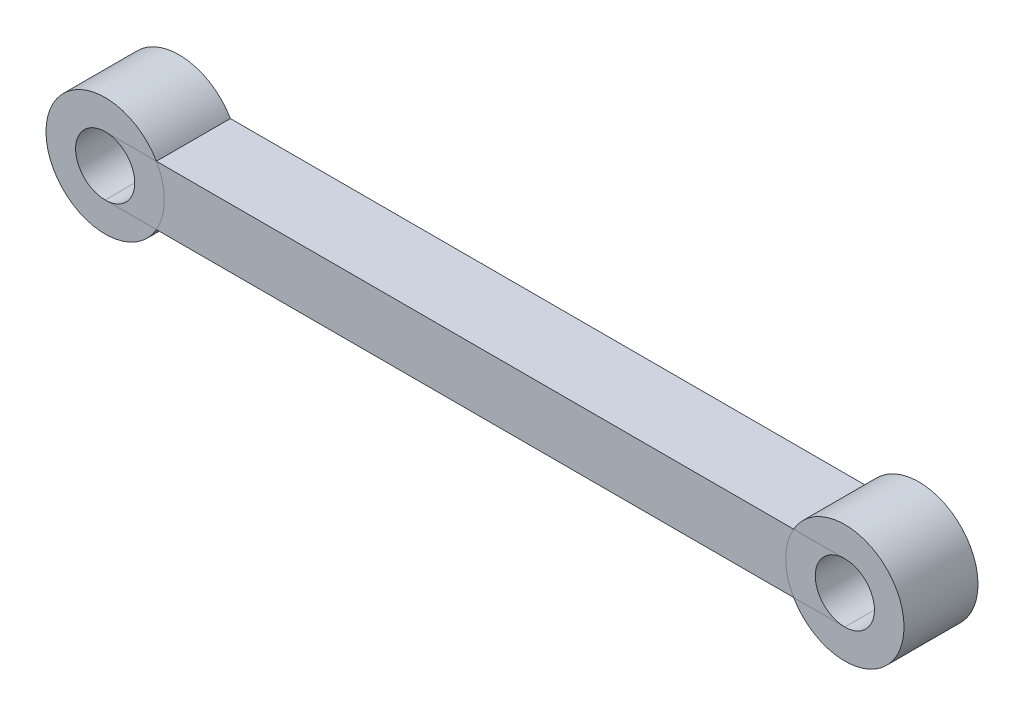
ISO-10303-21;
HEADER;
FILE_DESCRIPTION(('STEP AP214'),'2;1');
FILE_NAME('part.step','',(''),(''),'','','');
FILE_SCHEMA(('AUTOMOTIVE_DESIGN { 1 0 10303 214 1 1 1 1 }'));
ENDSEC;
DATA;
#1=APPLICATION_CONTEXT('core data for automotive mechanical design processes');
#2=APPLICATION_PROTOCOL_DEFINITION('international standard','automotive_design',2000,#1);
#3=PRODUCT_CONTEXT('',#1,'mechanical');
#4=PRODUCT('Part','Part','',(#3));
#5=PRODUCT_RELATED_PRODUCT_CATEGORY('part','',(#4));
#6=PRODUCT_DEFINITION_FORMATION('','',#4);
#7=PRODUCT_DEFINITION_CONTEXT('part definition',#1,'design');
#8=PRODUCT_DEFINITION('design','',#6,#7);
#9=PRODUCT_DEFINITION_SHAPE('','',#8);
#10=(LENGTH_UNIT() NAMED_UNIT(*) SI_UNIT(.MILLI.,.METRE.));
#11=(NAMED_UNIT(*) PLANE_ANGLE_UNIT() SI_UNIT($,.RADIAN.));
#12=(NAMED_UNIT(*) SI_UNIT($,.STERADIAN.) SOLID_ANGLE_UNIT());
#13=UNCERTAINTY_MEASURE_WITH_UNIT(LENGTH_MEASURE(1.E-05),#10,'distance_accuracy_value','');
#14=(GEOMETRIC_REPRESENTATION_CONTEXT(3) GLOBAL_UNCERTAINTY_ASSIGNED_CONTEXT((#13)) GLOBAL_UNIT_ASSIGNED_CONTEXT((#10,
#11,#12)) REPRESENTATION_CONTEXT('',''));
#15=CARTESIAN_POINT('',(0.,0.,0.));
#16=DIRECTION('',(0.,0.,1.));
#17=DIRECTION('',(1.,0.,0.));
#18=AXIS2_PLACEMENT_3D('',#15,#16,#17);
#19=CARTESIAN_POINT('',(0.,0.,0.));
#20=DIRECTION('',(0.,0.,1.));
#21=DIRECTION('',(1.,0.,0.));
#22=AXIS2_PLACEMENT_3D('',#19,#20,#21);
#23=CYLINDRICAL_SURFACE('',#22,4.00000000000002);
#24=CARTESIAN_POINT('',(0.,0.,5.));
#25=DIRECTION('',(0.,0.,1.));
#26=DIRECTION('',(1.,0.,0.));
#27=AXIS2_PLACEMENT_3D('',#24,#25,#26);
#28=CIRCLE('',#27,4.00000000000002);
#29=CARTESIAN_POINT('',(3.46410161513779,-1.99999999999995,5.));
#30=VERTEX_POINT('',#29);
#31=CARTESIAN_POINT('',(3.46410161513778,2.00000000000003,5.));
#32=VERTEX_POINT('',#31);
#33=EDGE_CURVE('P0_E97',#30,#32,#28,.T.);
#34=ORIENTED_EDGE('',*,*,#33,.F.);
#35=DIRECTION('',(0.,0.,1.));
#36=VECTOR('',#35,1.);
#37=CARTESIAN_POINT('',(3.46410161513779,-1.99999999999995,0.));
#38=LINE('',#37,#36);
#39=CARTESIAN_POINT('',(3.46410161513779,-1.99999999999995,0.));
#40=VERTEX_POINT('',#39);
#41=EDGE_CURVE('P0_E11',#40,#30,#38,.T.);
#42=ORIENTED_EDGE('',*,*,#41,.F.);
#43=CARTESIAN_POINT('',(0.,0.,0.));
#44=DIRECTION('',(0.,0.,1.));
#45=DIRECTION('',(1.,0.,0.));
#46=AXIS2_PLACEMENT_3D('',#43,#44,#45);
#47=CIRCLE('',#46,4.00000000000002);
#48=CARTESIAN_POINT('',(3.46410161513778,2.00000000000003,0.));
#49=VERTEX_POINT('',#48);
#50=EDGE_CURVE('P0_E91',#40,#49,#47,.T.);
#51=ORIENTED_EDGE('',*,*,#50,.T.);
#52=DIRECTION('',(0.,0.,1.));
#53=VECTOR('',#52,1.);
#54=CARTESIAN_POINT('',(3.46410161513778,2.00000000000003,0.));
#55=LINE('',#54,#53);
#56=EDGE_CURVE('P0_E36',#49,#32,#55,.T.);
#57=ORIENTED_EDGE('',*,*,#56,.T.);
#58=EDGE_LOOP('',(#34,#42,#51,#57));
#59=FACE_BOUND('',#58,.T.);
#60=ADVANCED_FACE('P0_F33',(#59),#23,.T.);
#61=CARTESIAN_POINT('',(0.,-2.,0.));
#62=DIRECTION('',(0.,-1.,0.));
#63=DIRECTION('',(1.,0.,0.));
#64=AXIS2_PLACEMENT_3D('',#61,#62,#63);
#65=PLANE('',#64);
#66=DIRECTION('',(1.,0.,0.));
#67=VECTOR('',#66,1.);
#68=CARTESIAN_POINT('',(0.,-2.,5.));
#69=LINE('',#68,#67);
#70=CARTESIAN_POINT('',(0.,-2.,5.));
#71=VERTEX_POINT('',#70);
#72=EDGE_CURVE('P0_E93',#71,#30,#69,.T.);
#73=ORIENTED_EDGE('',*,*,#72,.F.);
#74=DIRECTION('',(0.,0.,1.));
#75=VECTOR('',#74,1.);
#76=CARTESIAN_POINT('',(0.,-2.,0.));
#77=LINE('',#76,#75);
#78=CARTESIAN_POINT('',(0.,-2.,0.));
#79=VERTEX_POINT('',#78);
#80=EDGE_CURVE('P0_E42',#79,#71,#77,.T.);
#81=ORIENTED_EDGE('',*,*,#80,.F.);
#82=DIRECTION('',(1.,0.,0.));
#83=VECTOR('',#82,1.);
#84=CARTESIAN_POINT('',(0.,-2.,0.));
#85=LINE('',#84,#83);
#86=EDGE_CURVE('P0_E88',#79,#40,#85,.T.);
#87=ORIENTED_EDGE('',*,*,#86,.T.);
#88=ORIENTED_EDGE('',*,*,#41,.T.);
#89=EDGE_LOOP('',(#73,#81,#87,#88));
#90=FACE_BOUND('',#89,.T.);
#91=ADVANCED_FACE('P0_F107',(#90),#65,.T.);
#92=CARTESIAN_POINT('',(0.,0.,0.));
#93=DIRECTION('',(0.,0.,1.));
#94=DIRECTION('',(1.,0.,0.));
#95=AXIS2_PLACEMENT_3D('',#92,#93,#94);
#96=CYLINDRICAL_SURFACE('',#95,2.);
#97=CARTESIAN_POINT('',(0.,0.,5.));
#98=DIRECTION('',(0.,0.,-1.));
#99=DIRECTION('',(-1.,0.,0.));
#100=AXIS2_PLACEMENT_3D('',#97,#98,#99);
#101=CIRCLE('',#100,2.);
#102=CARTESIAN_POINT('',(0.,2.,5.));
#103=VERTEX_POINT('',#102);
#104=EDGE_CURVE('P0_E83',#103,#71,#101,.T.);
#105=ORIENTED_EDGE('',*,*,#104,.F.);
#106=DIRECTION('',(0.,0.,1.));
#107=VECTOR('',#106,1.);
#108=CARTESIAN_POINT('',(0.,2.,0.));
#109=LINE('',#108,#107);
#110=CARTESIAN_POINT('',(0.,2.,0.));
#111=VERTEX_POINT('',#110);
#112=EDGE_CURVE('P0_E78',#111,#103,#109,.T.);
#113=ORIENTED_EDGE('',*,*,#112,.F.);
#114=CARTESIAN_POINT('',(0.,0.,0.));
#115=DIRECTION('',(0.,0.,-1.));
#116=DIRECTION('',(-1.,0.,0.));
#117=AXIS2_PLACEMENT_3D('',#114,#115,#116);
#118=CIRCLE('',#117,2.);
#119=EDGE_CURVE('P0_E81',#111,#79,#118,.T.);
#120=ORIENTED_EDGE('',*,*,#119,.T.);
#121=ORIENTED_EDGE('',*,*,#80,.T.);
#122=EDGE_LOOP('',(#105,#113,#120,#121));
#123=FACE_BOUND('',#122,.T.);
#124=ADVANCED_FACE('P0_F80',(#123),#96,.F.);
#125=CARTESIAN_POINT('',(3.46410161513778,2.00000000000003,0.));
#126=DIRECTION('',(0.,1.,0.));
#127=DIRECTION('',(-1.,0.,0.));
#128=AXIS2_PLACEMENT_3D('',#125,#126,#127);
#129=PLANE('',#128);
#130=DIRECTION('',(-1.,0.,0.));
#131=VECTOR('',#130,1.);
#132=CARTESIAN_POINT('',(3.46410161513778,2.00000000000003,5.));
#133=LINE('',#132,#131);
#134=EDGE_CURVE('P0_E100',#32,#103,#133,.T.);
#135=ORIENTED_EDGE('',*,*,#134,.F.);
#136=ORIENTED_EDGE('',*,*,#56,.F.);
#137=DIRECTION('',(-1.,0.,0.));
#138=VECTOR('',#137,1.);
#139=CARTESIAN_POINT('',(3.46410161513778,2.00000000000003,0.));
#140=LINE('',#139,#138);
#141=EDGE_CURVE('P0_E87',#49,#111,#140,.T.);
#142=ORIENTED_EDGE('',*,*,#141,.T.);
#143=ORIENTED_EDGE('',*,*,#112,.T.);
#144=EDGE_LOOP('',(#135,#136,#142,#143));
#145=FACE_BOUND('',#144,.T.);
#146=ADVANCED_FACE('P0_F90',(#145),#129,.T.);
#147=CARTESIAN_POINT('',(0.,0.,0.));
#148=DIRECTION('',(0.,0.,1.));
#149=DIRECTION('',(1.,0.,0.));
#150=AXIS2_PLACEMENT_3D('',#147,#148,#149);
#151=PLANE('',#150);
#152=ORIENTED_EDGE('',*,*,#50,.F.);
#153=ORIENTED_EDGE('',*,*,#86,.F.);
#154=ORIENTED_EDGE('',*,*,#119,.F.);
#155=ORIENTED_EDGE('',*,*,#141,.F.);
#156=EDGE_LOOP('',(#152,#153,#154,#155));
#157=FACE_BOUND('',#156,.T.);
#158=ADVANCED_FACE('P0_F86',(#157),#151,.F.);
#159=CARTESIAN_POINT('',(0.,0.,5.));
#160=DIRECTION('',(0.,0.,1.));
#161=DIRECTION('',(1.,0.,0.));
#162=AXIS2_PLACEMENT_3D('',#159,#160,#161);
#163=PLANE('',#162);
#164=ORIENTED_EDGE('',*,*,#33,.T.);
#165=ORIENTED_EDGE('',*,*,#134,.T.);
#166=ORIENTED_EDGE('',*,*,#104,.T.);
#167=ORIENTED_EDGE('',*,*,#72,.T.);
#168=EDGE_LOOP('',(#164,#165,#166,#167));
#169=FACE_BOUND('',#168,.T.);
#170=ADVANCED_FACE('P0_F106',(#169),#163,.T.);
#171=CLOSED_SHELL('',(#60,#91,#124,#146,#158,#170));
#172=MANIFOLD_SOLID_BREP('P0_B2',#171);
#173=CARTESIAN_POINT('',(3.464101615138,-2.,0.));
#174=DIRECTION('',(0.,1.,0.));
#175=DIRECTION('',(0.,0.,1.));
#176=AXIS2_PLACEMENT_3D('',#173,#174,#175);
#177=PLANE('',#176);
#178=DIRECTION('',(0.,0.,-1.));
#179=VECTOR('',#178,1.);
#180=CARTESIAN_POINT('',(46.5358983848622,-1.9999999999999,0.));
#181=LINE('',#180,#179);
#182=CARTESIAN_POINT('',(46.5358983848622,-1.99999999999995,0.));
#183=VERTEX_POINT('',#182);
#184=CARTESIAN_POINT('',(46.5358983848622,-1.99999999999995,5.));
#185=VERTEX_POINT('',#184);
#186=EDGE_CURVE('P1_E69',#183,#185,#181,.F.);
#187=ORIENTED_EDGE('',*,*,#186,.T.);
#188=DIRECTION('',(1.,0.,0.));
#189=VECTOR('',#188,1.);
#190=CARTESIAN_POINT('',(0.,-2.,5.));
#191=LINE('',#190,#189);
#192=CARTESIAN_POINT('',(3.46410161513788,-2.,5.));
#193=VERTEX_POINT('',#192);
#194=EDGE_CURVE('P1_E95',#193,#185,#191,.T.);
#195=ORIENTED_EDGE('',*,*,#194,.F.);
#196=DIRECTION('',(0.,0.,1.));
#197=VECTOR('',#196,1.);
#198=CARTESIAN_POINT('',(3.464101615138,-2.,0.));
#199=LINE('',#198,#197);
#200=CARTESIAN_POINT('',(3.46410161513788,-2.,0.));
#201=VERTEX_POINT('',#200);
#202=EDGE_CURVE('P1_E71',#201,#193,#199,.T.);
#203=ORIENTED_EDGE('',*,*,#202,.F.);
#204=DIRECTION('',(1.,0.,0.));
#205=VECTOR('',#204,1.);
#206=CARTESIAN_POINT('',(0.,-2.,0.));
#207=LINE('',#206,#205);
#208=EDGE_CURVE('P1_E67',#201,#183,#207,.T.);
#209=ORIENTED_EDGE('',*,*,#208,.T.);
#210=EDGE_LOOP('',(#187,#195,#203,#209));
#211=FACE_BOUND('',#210,.T.);
#212=ADVANCED_FACE('P1_F20',(#211),#177,.F.);
#213=CARTESIAN_POINT('',(0.,0.,0.));
#214=DIRECTION('',(0.,0.,-1.));
#215=DIRECTION('',(-1.,0.,0.));
#216=AXIS2_PLACEMENT_3D('',#213,#214,#215);
#217=CYLINDRICAL_SURFACE('',#216,4.);
#218=CARTESIAN_POINT('',(0.,0.,5.));
#219=DIRECTION('',(0.,0.,-1.));
#220=DIRECTION('',(-1.,0.,0.));
#221=AXIS2_PLACEMENT_3D('',#218,#219,#220);
#222=CIRCLE('',#221,4.);
#223=CARTESIAN_POINT('',(3.46410161513788,2.,5.));
#224=VERTEX_POINT('',#223);
#225=EDGE_CURVE('P1_E23',#224,#193,#222,.T.);
#226=ORIENTED_EDGE('',*,*,#225,.F.);
#227=DIRECTION('',(0.,0.,1.));
#228=VECTOR('',#227,1.);
#229=CARTESIAN_POINT('',(3.464101615138,2.,0.));
#230=LINE('',#229,#228);
#231=CARTESIAN_POINT('',(3.46410161513788,2.,0.));
#232=VERTEX_POINT('',#231);
#233=EDGE_CURVE('P1_E61',#232,#224,#230,.T.);
#234=ORIENTED_EDGE('',*,*,#233,.F.);
#235=CARTESIAN_POINT('',(0.,0.,0.));
#236=DIRECTION('',(0.,0.,-1.));
#237=DIRECTION('',(-1.,0.,0.));
#238=AXIS2_PLACEMENT_3D('',#235,#236,#237);
#239=CIRCLE('',#238,4.);
#240=EDGE_CURVE('P1_E83',#232,#201,#239,.T.);
#241=ORIENTED_EDGE('',*,*,#240,.T.);
#242=ORIENTED_EDGE('',*,*,#202,.T.);
#243=EDGE_LOOP('',(#226,#234,#241,#242));
#244=FACE_BOUND('',#243,.T.);
#245=ADVANCED_FACE('P1_F109',(#244),#217,.F.);
#246=CARTESIAN_POINT('',(0.,-2.,5.));
#247=DIRECTION('',(0.,0.,1.));
#248=DIRECTION('',(1.,0.,0.));
#249=AXIS2_PLACEMENT_3D('',#246,#247,#248);
#250=PLANE('',#249);
#251=DIRECTION('',(1.,0.,0.));
#252=VECTOR('',#251,1.);
#253=CARTESIAN_POINT('',(3.464101615138,2.,5.));
#254=LINE('',#253,#252);
#255=CARTESIAN_POINT('',(46.5358983848621,2.,5.));
#256=VERTEX_POINT('',#255);
#257=EDGE_CURVE('P1_E94',#224,#256,#254,.T.);
#258=ORIENTED_EDGE('',*,*,#257,.F.);
#259=ORIENTED_EDGE('',*,*,#225,.T.);
#260=ORIENTED_EDGE('',*,*,#194,.T.);
#261=CARTESIAN_POINT('',(50.,0.,5.));
#262=DIRECTION('',(0.,0.,-1.));
#263=DIRECTION('',(-1.,0.,0.));
#264=AXIS2_PLACEMENT_3D('',#261,#262,#263);
#265=CIRCLE('',#264,4.);
#266=EDGE_CURVE('P1_E74',#185,#256,#265,.T.);
#267=ORIENTED_EDGE('',*,*,#266,.T.);
#268=EDGE_LOOP('',(#258,#259,#260,#267));
#269=FACE_BOUND('',#268,.T.);
#270=ADVANCED_FACE('P1_F92',(#269),#250,.T.);
#271=CARTESIAN_POINT('',(50.,0.,0.));
#272=DIRECTION('',(0.,0.,-1.));
#273=DIRECTION('',(-1.,0.,0.));
#274=AXIS2_PLACEMENT_3D('',#271,#272,#273);
#275=CYLINDRICAL_SURFACE('',#274,4.);
#276=ORIENTED_EDGE('',*,*,#266,.F.);
#277=ORIENTED_EDGE('',*,*,#186,.F.);
#278=CARTESIAN_POINT('',(50.,0.,0.));
#279=DIRECTION('',(0.,0.,-1.));
#280=DIRECTION('',(-1.,0.,0.));
#281=AXIS2_PLACEMENT_3D('',#278,#279,#280);
#282=CIRCLE('',#281,4.);
#283=CARTESIAN_POINT('',(46.5358983848621,2.,0.));
#284=VERTEX_POINT('',#283);
#285=EDGE_CURVE('P1_E39',#183,#284,#282,.T.);
#286=ORIENTED_EDGE('',*,*,#285,.T.);
#287=DIRECTION('',(0.,0.,1.));
#288=VECTOR('',#287,1.);
#289=CARTESIAN_POINT('',(46.535898384862,2.,0.));
#290=LINE('',#289,#288);
#291=EDGE_CURVE('P1_E30',#256,#284,#290,.F.);
#292=ORIENTED_EDGE('',*,*,#291,.F.);
#293=EDGE_LOOP('',(#276,#277,#286,#292));
#294=FACE_BOUND('',#293,.T.);
#295=ADVANCED_FACE('P1_F77',(#294),#275,.F.);
#296=CARTESIAN_POINT('',(0.,-2.,0.));
#297=DIRECTION('',(0.,0.,1.));
#298=DIRECTION('',(1.,0.,0.));
#299=AXIS2_PLACEMENT_3D('',#296,#297,#298);
#300=PLANE('',#299);
#301=DIRECTION('',(1.,0.,0.));
#302=VECTOR('',#301,1.);
#303=CARTESIAN_POINT('',(3.464101615138,2.,0.));
#304=LINE('',#303,#302);
#305=EDGE_CURVE('P1_E12',#284,#232,#304,.F.);
#306=ORIENTED_EDGE('',*,*,#305,.F.);
#307=ORIENTED_EDGE('',*,*,#285,.F.);
#308=ORIENTED_EDGE('',*,*,#208,.F.);
#309=ORIENTED_EDGE('',*,*,#240,.F.);
#310=EDGE_LOOP('',(#306,#307,#308,#309));
#311=FACE_BOUND('',#310,.T.);
#312=ADVANCED_FACE('P1_F80',(#311),#300,.F.);
#313=CARTESIAN_POINT('',(3.464101615138,2.,0.));
#314=DIRECTION('',(0.,1.,0.));
#315=DIRECTION('',(0.,0.,1.));
#316=AXIS2_PLACEMENT_3D('',#313,#314,#315);
#317=PLANE('',#316);
#318=ORIENTED_EDGE('',*,*,#291,.T.);
#319=ORIENTED_EDGE('',*,*,#305,.T.);
#320=ORIENTED_EDGE('',*,*,#233,.T.);
#321=ORIENTED_EDGE('',*,*,#257,.T.);
#322=EDGE_LOOP('',(#318,#319,#320,#321));
#323=FACE_BOUND('',#322,.T.);
#324=ADVANCED_FACE('P1_F99',(#323),#317,.T.);
#325=CLOSED_SHELL('',(#212,#245,#270,#295,#312,#324));
#326=MANIFOLD_SOLID_BREP('P1_B1',#325);
#327=CARTESIAN_POINT('',(50.,0.,0.));
#328=DIRECTION('',(0.,0.,-1.));
#329=DIRECTION('',(-1.,0.,0.));
#330=AXIS2_PLACEMENT_3D('',#327,#328,#329);
#331=CYLINDRICAL_SURFACE('',#330,4.);
#332=CARTESIAN_POINT('',(50.,0.,5.));
#333=DIRECTION('',(0.,0.,-1.));
#334=DIRECTION('',(-1.,0.,0.));
#335=AXIS2_PLACEMENT_3D('',#332,#333,#334);
#336=CIRCLE('',#335,4.);
#337=CARTESIAN_POINT('',(46.5358983848621,2.,5.));
#338=VERTEX_POINT('',#337);
#339=CARTESIAN_POINT('',(46.5358983848621,-2.,5.));
#340=VERTEX_POINT('',#339);
#341=EDGE_CURVE('P2_E74',#338,#340,#336,.F.);
#342=ORIENTED_EDGE('',*,*,#341,.F.);
#343=DIRECTION('',(0.,0.,1.));
#344=VECTOR('',#343,1.);
#345=CARTESIAN_POINT('',(46.535898384862,2.,0.));
#346=LINE('',#345,#344);
#347=CARTESIAN_POINT('',(46.5358983848621,2.,0.));
#348=VERTEX_POINT('',#347);
#349=EDGE_CURVE('P2_E69',#348,#338,#346,.T.);
#350=ORIENTED_EDGE('',*,*,#349,.F.);
#351=CARTESIAN_POINT('',(50.,0.,0.));
#352=DIRECTION('',(0.,0.,-1.));
#353=DIRECTION('',(-1.,0.,0.));
#354=AXIS2_PLACEMENT_3D('',#351,#352,#353);
#355=CIRCLE('',#354,4.);
#356=CARTESIAN_POINT('',(46.5358983848621,-2.,0.));
#357=VERTEX_POINT('',#356);
#358=EDGE_CURVE('P2_E22',#348,#357,#355,.F.);
#359=ORIENTED_EDGE('',*,*,#358,.T.);
#360=DIRECTION('',(0.,0.,1.));
#361=VECTOR('',#360,1.);
#362=CARTESIAN_POINT('',(46.535898384862,-2.,0.));
#363=LINE('',#362,#361);
#364=EDGE_CURVE('P2_E67',#357,#340,#363,.T.);
#365=ORIENTED_EDGE('',*,*,#364,.T.);
#366=EDGE_LOOP('',(#342,#350,#359,#365));
#367=FACE_BOUND('',#366,.T.);
#368=ADVANCED_FACE('P2_F19',(#367),#331,.T.);
#369=CARTESIAN_POINT('',(0.,-2.,0.));
#370=DIRECTION('',(0.,0.,1.));
#371=DIRECTION('',(1.,0.,0.));
#372=AXIS2_PLACEMENT_3D('',#369,#370,#371);
#373=PLANE('',#372);
#374=DIRECTION('',(1.,0.,0.));
#375=VECTOR('',#374,1.);
#376=CARTESIAN_POINT('',(46.535898384862,-2.,0.));
#377=LINE('',#376,#375);
#378=CARTESIAN_POINT('',(50.,-2.,0.));
#379=VERTEX_POINT('',#378);
#380=EDGE_CURVE('P2_E62',#379,#357,#377,.F.);
#381=ORIENTED_EDGE('',*,*,#380,.T.);
#382=ORIENTED_EDGE('',*,*,#358,.F.);
#383=DIRECTION('',(1.,0.,0.));
#384=VECTOR('',#383,1.);
#385=CARTESIAN_POINT('',(46.535898384862,2.,0.));
#386=LINE('',#385,#384);
#387=CARTESIAN_POINT('',(50.,2.,0.));
#388=VERTEX_POINT('',#387);
#389=EDGE_CURVE('P2_E61',#388,#348,#386,.F.);
#390=ORIENTED_EDGE('',*,*,#389,.F.);
#391=CARTESIAN_POINT('',(50.,0.,0.));
#392=DIRECTION('',(0.,0.,-1.));
#393=DIRECTION('',(-1.,0.,0.));
#394=AXIS2_PLACEMENT_3D('',#391,#392,#393);
#395=CIRCLE('',#394,2.);
#396=EDGE_CURVE('P2_E72',#388,#379,#395,.F.);
#397=ORIENTED_EDGE('',*,*,#396,.T.);
#398=EDGE_LOOP('',(#381,#382,#390,#397));
#399=FACE_BOUND('',#398,.T.);
#400=ADVANCED_FACE('P2_F59',(#399),#373,.F.);
#401=CARTESIAN_POINT('',(46.535898384862,-2.,0.));
#402=DIRECTION('',(0.,1.,0.));
#403=DIRECTION('',(0.,0.,1.));
#404=AXIS2_PLACEMENT_3D('',#401,#402,#403);
#405=PLANE('',#404);
#406=DIRECTION('',(0.,0.,-1.));
#407=VECTOR('',#406,1.);
#408=CARTESIAN_POINT('',(50.,-2.,0.));
#409=LINE('',#408,#407);
#410=CARTESIAN_POINT('',(50.,-2.,5.));
#411=VERTEX_POINT('',#410);
#412=EDGE_CURVE('P2_E90',#379,#411,#409,.F.);
#413=ORIENTED_EDGE('',*,*,#412,.T.);
#414=DIRECTION('',(1.,0.,0.));
#415=VECTOR('',#414,1.);
#416=CARTESIAN_POINT('',(0.,-2.,5.));
#417=LINE('',#416,#415);
#418=EDGE_CURVE('P2_E76',#340,#411,#417,.T.);
#419=ORIENTED_EDGE('',*,*,#418,.F.);
#420=ORIENTED_EDGE('',*,*,#364,.F.);
#421=ORIENTED_EDGE('',*,*,#380,.F.);
#422=EDGE_LOOP('',(#413,#419,#420,#421));
#423=FACE_BOUND('',#422,.T.);
#424=ADVANCED_FACE('P2_F104',(#423),#405,.F.);
#425=CARTESIAN_POINT('',(0.,-2.,5.));
#426=DIRECTION('',(0.,0.,1.));
#427=DIRECTION('',(1.,0.,0.));
#428=AXIS2_PLACEMENT_3D('',#425,#426,#427);
#429=PLANE('',#428);
#430=ORIENTED_EDGE('',*,*,#418,.T.);
#431=CARTESIAN_POINT('',(50.,0.,5.));
#432=DIRECTION('',(0.,0.,-1.));
#433=DIRECTION('',(-1.,0.,0.));
#434=AXIS2_PLACEMENT_3D('',#431,#432,#433);
#435=CIRCLE('',#434,2.);
#436=CARTESIAN_POINT('',(50.,2.,5.));
#437=VERTEX_POINT('',#436);
#438=EDGE_CURVE('P2_E29',#411,#437,#435,.T.);
#439=ORIENTED_EDGE('',*,*,#438,.T.);
#440=DIRECTION('',(1.,0.,0.));
#441=VECTOR('',#440,1.);
#442=CARTESIAN_POINT('',(46.535898384862,2.,5.));
#443=LINE('',#442,#441);
#444=EDGE_CURVE('P2_E37',#338,#437,#443,.T.);
#445=ORIENTED_EDGE('',*,*,#444,.F.);
#446=ORIENTED_EDGE('',*,*,#341,.T.);
#447=EDGE_LOOP('',(#430,#439,#445,#446));
#448=FACE_BOUND('',#447,.T.);
#449=ADVANCED_FACE('P2_F109',(#448),#429,.T.);
#450=CARTESIAN_POINT('',(46.535898384862,2.,0.));
#451=DIRECTION('',(0.,1.,0.));
#452=DIRECTION('',(0.,0.,1.));
#453=AXIS2_PLACEMENT_3D('',#450,#451,#452);
#454=PLANE('',#453);
#455=DIRECTION('',(0.,0.,-1.));
#456=VECTOR('',#455,1.);
#457=CARTESIAN_POINT('',(50.,2.,0.));
#458=LINE('',#457,#456);
#459=EDGE_CURVE('P2_E11',#437,#388,#458,.T.);
#460=ORIENTED_EDGE('',*,*,#459,.T.);
#461=ORIENTED_EDGE('',*,*,#389,.T.);
#462=ORIENTED_EDGE('',*,*,#349,.T.);
#463=ORIENTED_EDGE('',*,*,#444,.T.);
#464=EDGE_LOOP('',(#460,#461,#462,#463));
#465=FACE_BOUND('',#464,.T.);
#466=ADVANCED_FACE('P2_F68',(#465),#454,.T.);
#467=CARTESIAN_POINT('',(50.,0.,0.));
#468=DIRECTION('',(0.,0.,-1.));
#469=DIRECTION('',(-1.,0.,0.));
#470=AXIS2_PLACEMENT_3D('',#467,#468,#469);
#471=CYLINDRICAL_SURFACE('',#470,2.);
#472=ORIENTED_EDGE('',*,*,#438,.F.);
#473=ORIENTED_EDGE('',*,*,#412,.F.);
#474=ORIENTED_EDGE('',*,*,#396,.F.);
#475=ORIENTED_EDGE('',*,*,#459,.F.);
#476=EDGE_LOOP('',(#472,#473,#474,#475));
#477=FACE_BOUND('',#476,.T.);
#478=ADVANCED_FACE('P2_F108',(#477),#471,.F.);
#479=CLOSED_SHELL('',(#368,#400,#424,#449,#466,#478));
#480=MANIFOLD_SOLID_BREP('P2_B1',#479);
#481=CARTESIAN_POINT('',(0.,0.,0.));
#482=DIRECTION('',(0.,0.,-1.));
#483=DIRECTION('',(-1.,0.,0.));
#484=AXIS2_PLACEMENT_3D('',#481,#482,#483);
#485=CYLINDRICAL_SURFACE('',#484,2.);
#486=CARTESIAN_POINT('',(0.,0.,5.));
#487=DIRECTION('',(0.,0.,-1.));
#488=DIRECTION('',(-1.,0.,0.));
#489=AXIS2_PLACEMENT_3D('',#486,#487,#488);
#490=CIRCLE('',#489,2.);
#491=CARTESIAN_POINT('',(0.,-2.,5.));
#492=VERTEX_POINT('',#491);
#493=CARTESIAN_POINT('',(0.,2.,5.));
#494=VERTEX_POINT('',#493);
#495=EDGE_CURVE('P3_E62',#492,#494,#490,.T.);
#496=ORIENTED_EDGE('',*,*,#495,.F.);
#497=DIRECTION('',(0.,0.,1.));
#498=VECTOR('',#497,1.);
#499=CARTESIAN_POINT('',(0.,-2.,0.));
#500=LINE('',#499,#498);
#501=CARTESIAN_POINT('',(0.,-2.,0.));
#502=VERTEX_POINT('',#501);
#503=EDGE_CURVE('P3_E59',#502,#492,#500,.T.);
#504=ORIENTED_EDGE('',*,*,#503,.F.);
#505=CARTESIAN_POINT('',(0.,0.,0.));
#506=DIRECTION('',(0.,0.,-1.));
#507=DIRECTION('',(-1.,0.,0.));
#508=AXIS2_PLACEMENT_3D('',#505,#506,#507);
#509=CIRCLE('',#508,2.);
#510=CARTESIAN_POINT('',(0.,2.,0.));
#511=VERTEX_POINT('',#510);
#512=EDGE_CURVE('P3_E23',#502,#511,#509,.T.);
#513=ORIENTED_EDGE('',*,*,#512,.T.);
#514=DIRECTION('',(0.,0.,1.));
#515=VECTOR('',#514,1.);
#516=CARTESIAN_POINT('',(0.,2.,0.));
#517=LINE('',#516,#515);
#518=EDGE_CURVE('P3_E90',#511,#494,#517,.T.);
#519=ORIENTED_EDGE('',*,*,#518,.T.);
#520=EDGE_LOOP('',(#496,#504,#513,#519));
#521=FACE_BOUND('',#520,.T.);
#522=ADVANCED_FACE('P3_F20',(#521),#485,.F.);
#523=CARTESIAN_POINT('',(0.,0.,0.));
#524=DIRECTION('',(0.,0.,1.));
#525=DIRECTION('',(1.,0.,0.));
#526=AXIS2_PLACEMENT_3D('',#523,#524,#525);
#527=PLANE('',#526);
#528=CARTESIAN_POINT('',(0.,0.,0.));
#529=DIRECTION('',(0.,0.,-1.));
#530=DIRECTION('',(-1.,0.,0.));
#531=AXIS2_PLACEMENT_3D('',#528,#529,#530);
#532=CIRCLE('',#531,4.);
#533=CARTESIAN_POINT('',(3.46410161513779,1.99999999999995,0.));
#534=VERTEX_POINT('',#533);
#535=CARTESIAN_POINT('',(3.46410161513779,-1.99999999999995,0.));
#536=VERTEX_POINT('',#535);
#537=EDGE_CURVE('P3_E89',#534,#536,#532,.F.);
#538=ORIENTED_EDGE('',*,*,#537,.F.);
#539=DIRECTION('',(1.,0.,0.));
#540=VECTOR('',#539,1.);
#541=CARTESIAN_POINT('',(0.,2.,0.));
#542=LINE('',#541,#540);
#543=EDGE_CURVE('P3_E73',#534,#511,#542,.F.);
#544=ORIENTED_EDGE('',*,*,#543,.T.);
#545=ORIENTED_EDGE('',*,*,#512,.F.);
#546=DIRECTION('',(1.,0.,0.));
#547=VECTOR('',#546,1.);
#548=CARTESIAN_POINT('',(0.,-2.,0.));
#549=LINE('',#548,#547);
#550=EDGE_CURVE('P3_E67',#536,#502,#549,.F.);
#551=ORIENTED_EDGE('',*,*,#550,.F.);
#552=EDGE_LOOP('',(#538,#544,#545,#551));
#553=FACE_BOUND('',#552,.T.);
#554=ADVANCED_FACE('P3_F70',(#553),#527,.F.);
#555=CARTESIAN_POINT('',(0.,-2.,0.));
#556=DIRECTION('',(0.,1.,0.));
#557=DIRECTION('',(0.,0.,1.));
#558=AXIS2_PLACEMENT_3D('',#555,#556,#557);
#559=PLANE('',#558);
#560=DIRECTION('',(0.,0.,-1.));
#561=VECTOR('',#560,1.);
#562=CARTESIAN_POINT('',(3.46410161513782,-1.99999999999989,0.));
#563=LINE('',#562,#561);
#564=CARTESIAN_POINT('',(3.46410161513779,-1.99999999999995,5.));
#565=VERTEX_POINT('',#564);
#566=EDGE_CURVE('P3_E78',#536,#565,#563,.F.);
#567=ORIENTED_EDGE('',*,*,#566,.F.);
#568=ORIENTED_EDGE('',*,*,#550,.T.);
#569=ORIENTED_EDGE('',*,*,#503,.T.);
#570=DIRECTION('',(1.,0.,0.));
#571=VECTOR('',#570,1.);
#572=CARTESIAN_POINT('',(0.,-2.,5.));
#573=LINE('',#572,#571);
#574=EDGE_CURVE('P3_E84',#565,#492,#573,.F.);
#575=ORIENTED_EDGE('',*,*,#574,.F.);
#576=EDGE_LOOP('',(#567,#568,#569,#575));
#577=FACE_BOUND('',#576,.T.);
#578=ADVANCED_FACE('P3_F76',(#577),#559,.T.);
#579=CARTESIAN_POINT('',(0.,0.,5.));
#580=DIRECTION('',(0.,0.,1.));
#581=DIRECTION('',(1.,0.,0.));
#582=AXIS2_PLACEMENT_3D('',#579,#580,#581);
#583=PLANE('',#582);
#584=CARTESIAN_POINT('',(0.,0.,5.));
#585=DIRECTION('',(0.,0.,-1.));
#586=DIRECTION('',(-1.,0.,0.));
#587=AXIS2_PLACEMENT_3D('',#584,#585,#586);
#588=CIRCLE('',#587,4.);
#589=CARTESIAN_POINT('',(3.46410161513779,1.99999999999995,5.));
#590=VERTEX_POINT('',#589);
#591=EDGE_CURVE('P3_E29',#565,#590,#588,.T.);
#592=ORIENTED_EDGE('',*,*,#591,.F.);
#593=ORIENTED_EDGE('',*,*,#574,.T.);
#594=ORIENTED_EDGE('',*,*,#495,.T.);
#595=DIRECTION('',(1.,0.,0.));
#596=VECTOR('',#595,1.);
#597=CARTESIAN_POINT('',(0.,2.,5.));
#598=LINE('',#597,#596);
#599=EDGE_CURVE('P3_E38',#494,#590,#598,.T.);
#600=ORIENTED_EDGE('',*,*,#599,.T.);
#601=EDGE_LOOP('',(#592,#593,#594,#600));
#602=FACE_BOUND('',#601,.T.);
#603=ADVANCED_FACE('P3_F103',(#602),#583,.T.);
#604=CARTESIAN_POINT('',(0.,2.,0.));
#605=DIRECTION('',(0.,1.,0.));
#606=DIRECTION('',(0.,0.,1.));
#607=AXIS2_PLACEMENT_3D('',#604,#605,#606);
#608=PLANE('',#607);
#609=DIRECTION('',(0.,0.,-1.));
#610=VECTOR('',#609,1.);
#611=CARTESIAN_POINT('',(3.46410161513782,1.99999999999989,0.));
#612=LINE('',#611,#610);
#613=EDGE_CURVE('P3_E12',#590,#534,#612,.T.);
#614=ORIENTED_EDGE('',*,*,#613,.F.);
#615=ORIENTED_EDGE('',*,*,#599,.F.);
#616=ORIENTED_EDGE('',*,*,#518,.F.);
#617=ORIENTED_EDGE('',*,*,#543,.F.);
#618=EDGE_LOOP('',(#614,#615,#616,#617));
#619=FACE_BOUND('',#618,.T.);
#620=ADVANCED_FACE('P3_F111',(#619),#608,.F.);
#621=CARTESIAN_POINT('',(0.,0.,0.));
#622=DIRECTION('',(0.,0.,-1.));
#623=DIRECTION('',(-1.,0.,0.));
#624=AXIS2_PLACEMENT_3D('',#621,#622,#623);
#625=CYLINDRICAL_SURFACE('',#624,4.);
#626=ORIENTED_EDGE('',*,*,#591,.T.);
#627=ORIENTED_EDGE('',*,*,#613,.T.);
#628=ORIENTED_EDGE('',*,*,#537,.T.);
#629=ORIENTED_EDGE('',*,*,#566,.T.);
#630=EDGE_LOOP('',(#626,#627,#628,#629));
#631=FACE_BOUND('',#630,.T.);
#632=ADVANCED_FACE('P3_F105',(#631),#625,.T.);
#633=CLOSED_SHELL('',(#522,#554,#578,#603,#620,#632));
#634=MANIFOLD_SOLID_BREP('P3_B1',#633);
#635=CARTESIAN_POINT('',(50.,0.,0.));
#636=DIRECTION('',(0.,0.,-1.));
#637=DIRECTION('',(-1.,0.,0.));
#638=AXIS2_PLACEMENT_3D('',#635,#636,#637);
#639=CYLINDRICAL_SURFACE('',#638,2.);
#640=CARTESIAN_POINT('',(50.,0.,5.));
#641=DIRECTION('',(0.,0.,-1.));
#642=DIRECTION('',(-1.,0.,0.));
#643=AXIS2_PLACEMENT_3D('',#640,#641,#642);
#644=CIRCLE('',#643,2.);
#645=CARTESIAN_POINT('',(50.,2.,5.));
#646=VERTEX_POINT('',#645);
#647=CARTESIAN_POINT('',(50.,-2.,5.));
#648=VERTEX_POINT('',#647);
#649=EDGE_CURVE('P4_E73',#646,#648,#644,.T.);
#650=ORIENTED_EDGE('',*,*,#649,.F.);
#651=DIRECTION('',(0.,0.,1.));
#652=VECTOR('',#651,1.);
#653=CARTESIAN_POINT('',(50.,2.,0.));
#654=LINE('',#653,#652);
#655=CARTESIAN_POINT('',(50.,2.,0.));
#656=VERTEX_POINT('',#655);
#657=EDGE_CURVE('P4_E71',#646,#656,#654,.F.);
#658=ORIENTED_EDGE('',*,*,#657,.T.);
#659=CARTESIAN_POINT('',(50.,0.,0.));
#660=DIRECTION('',(0.,0.,-1.));
#661=DIRECTION('',(-1.,0.,0.));
#662=AXIS2_PLACEMENT_3D('',#659,#660,#661);
#663=CIRCLE('',#662,2.);
#664=CARTESIAN_POINT('',(50.,-2.,0.));
#665=VERTEX_POINT('',#664);
#666=EDGE_CURVE('P4_E23',#656,#665,#663,.T.);
#667=ORIENTED_EDGE('',*,*,#666,.T.);
#668=DIRECTION('',(0.,0.,1.));
#669=VECTOR('',#668,1.);
#670=CARTESIAN_POINT('',(50.,-2.,0.));
#671=LINE('',#670,#669);
#672=EDGE_CURVE('P4_E59',#648,#665,#671,.F.);
#673=ORIENTED_EDGE('',*,*,#672,.F.);
#674=EDGE_LOOP('',(#650,#658,#667,#673));
#675=FACE_BOUND('',#674,.T.);
#676=ADVANCED_FACE('P4_F20',(#675),#639,.F.);
#677=CARTESIAN_POINT('',(46.535898384862,-2.,0.));
#678=DIRECTION('',(0.,1.,0.));
#679=DIRECTION('',(0.,0.,1.));
#680=AXIS2_PLACEMENT_3D('',#677,#678,#679);
#681=PLANE('',#680);
#682=ORIENTED_EDGE('',*,*,#672,.T.);
#683=DIRECTION('',(1.,0.,0.));
#684=VECTOR('',#683,1.);
#685=CARTESIAN_POINT('',(50.,-2.,0.));
#686=LINE('',#685,#684);
#687=CARTESIAN_POINT('',(46.5358983848622,-1.99999999999995,0.));
#688=VERTEX_POINT('',#687);
#689=EDGE_CURVE('P4_E68',#665,#688,#686,.F.);
#690=ORIENTED_EDGE('',*,*,#689,.T.);
#691=DIRECTION('',(0.,0.,-1.));
#692=VECTOR('',#691,1.);
#693=CARTESIAN_POINT('',(46.5358983848622,-1.9999999999999,0.));
#694=LINE('',#693,#692);
#695=CARTESIAN_POINT('',(46.5358983848622,-1.99999999999995,5.));
#696=VERTEX_POINT('',#695);
#697=EDGE_CURVE('P4_E90',#696,#688,#694,.T.);
#698=ORIENTED_EDGE('',*,*,#697,.F.);
#699=DIRECTION('',(1.,0.,0.));
#700=VECTOR('',#699,1.);
#701=CARTESIAN_POINT('',(50.,-2.,5.));
#702=LINE('',#701,#700);
#703=EDGE_CURVE('P4_E80',#648,#696,#702,.F.);
#704=ORIENTED_EDGE('',*,*,#703,.F.);
#705=EDGE_LOOP('',(#682,#690,#698,#704));
#706=FACE_BOUND('',#705,.T.);
#707=ADVANCED_FACE('P4_F114',(#706),#681,.T.);
#708=CARTESIAN_POINT('',(50.,0.,0.));
#709=DIRECTION('',(0.,0.,1.));
#710=DIRECTION('',(1.,0.,0.));
#711=AXIS2_PLACEMENT_3D('',#708,#709,#710);
#712=PLANE('',#711);
#713=ORIENTED_EDGE('',*,*,#666,.F.);
#714=DIRECTION('',(1.,0.,0.));
#715=VECTOR('',#714,1.);
#716=CARTESIAN_POINT('',(46.535898384862,2.,0.));
#717=LINE('',#716,#715);
#718=CARTESIAN_POINT('',(46.5358983848622,1.99999999999995,0.));
#719=VERTEX_POINT('',#718);
#720=EDGE_CURVE('P4_E67',#656,#719,#717,.F.);
#721=ORIENTED_EDGE('',*,*,#720,.T.);
#722=CARTESIAN_POINT('',(50.,0.,0.));
#723=DIRECTION('',(0.,0.,-1.));
#724=DIRECTION('',(-1.,0.,0.));
#725=AXIS2_PLACEMENT_3D('',#722,#723,#724);
#726=CIRCLE('',#725,4.);
#727=EDGE_CURVE('P4_E93',#688,#719,#726,.F.);
#728=ORIENTED_EDGE('',*,*,#727,.F.);
#729=ORIENTED_EDGE('',*,*,#689,.F.);
#730=EDGE_LOOP('',(#713,#721,#728,#729));
#731=FACE_BOUND('',#730,.T.);
#732=ADVANCED_FACE('P4_F65',(#731),#712,.F.);
#733=CARTESIAN_POINT('',(46.535898384862,2.,0.));
#734=DIRECTION('',(0.,1.,0.));
#735=DIRECTION('',(0.,0.,1.));
#736=AXIS2_PLACEMENT_3D('',#733,#734,#735);
#737=PLANE('',#736);
#738=ORIENTED_EDGE('',*,*,#657,.F.);
#739=DIRECTION('',(1.,0.,0.));
#740=VECTOR('',#739,1.);
#741=CARTESIAN_POINT('',(50.,2.,5.));
#742=LINE('',#741,#740);
#743=CARTESIAN_POINT('',(46.5358983848622,1.99999999999995,5.));
#744=VERTEX_POINT('',#743);
#745=EDGE_CURVE('P4_E39',#744,#646,#742,.T.);
#746=ORIENTED_EDGE('',*,*,#745,.F.);
#747=DIRECTION('',(0.,0.,-1.));
#748=VECTOR('',#747,1.);
#749=CARTESIAN_POINT('',(46.5358983848622,1.9999999999999,0.));
#750=LINE('',#749,#748);
#751=EDGE_CURVE('P4_E31',#719,#744,#750,.F.);
#752=ORIENTED_EDGE('',*,*,#751,.F.);
#753=ORIENTED_EDGE('',*,*,#720,.F.);
#754=EDGE_LOOP('',(#738,#746,#752,#753));
#755=FACE_BOUND('',#754,.T.);
#756=ADVANCED_FACE('P4_F76',(#755),#737,.F.);
#757=CARTESIAN_POINT('',(50.,0.,5.));
#758=DIRECTION('',(0.,0.,1.));
#759=DIRECTION('',(1.,0.,0.));
#760=AXIS2_PLACEMENT_3D('',#757,#758,#759);
#761=PLANE('',#760);
#762=ORIENTED_EDGE('',*,*,#745,.T.);
#763=ORIENTED_EDGE('',*,*,#649,.T.);
#764=ORIENTED_EDGE('',*,*,#703,.T.);
#765=CARTESIAN_POINT('',(50.,0.,5.));
#766=DIRECTION('',(0.,0.,-1.));
#767=DIRECTION('',(-1.,0.,0.));
#768=AXIS2_PLACEMENT_3D('',#765,#766,#767);
#769=CIRCLE('',#768,4.);
#770=EDGE_CURVE('P4_E12',#744,#696,#769,.T.);
#771=ORIENTED_EDGE('',*,*,#770,.F.);
#772=EDGE_LOOP('',(#762,#763,#764,#771));
#773=FACE_BOUND('',#772,.T.);
#774=ADVANCED_FACE('P4_F107',(#773),#761,.T.);
#775=CARTESIAN_POINT('',(50.,0.,0.));
#776=DIRECTION('',(0.,0.,-1.));
#777=DIRECTION('',(-1.,0.,0.));
#778=AXIS2_PLACEMENT_3D('',#775,#776,#777);
#779=CYLINDRICAL_SURFACE('',#778,4.);
#780=ORIENTED_EDGE('',*,*,#770,.T.);
#781=ORIENTED_EDGE('',*,*,#697,.T.);
#782=ORIENTED_EDGE('',*,*,#727,.T.);
#783=ORIENTED_EDGE('',*,*,#751,.T.);
#784=EDGE_LOOP('',(#780,#781,#782,#783));
#785=FACE_BOUND('',#784,.T.);
#786=ADVANCED_FACE('P4_F110',(#785),#779,.T.);
#787=CLOSED_SHELL('',(#676,#707,#732,#756,#774,#786));
#788=MANIFOLD_SOLID_BREP('P4_B1',#787);
#789=ADVANCED_BREP_SHAPE_REPRESENTATION('',(#18,#172,#326,#480,#634,#788),#14);
#790=SHAPE_DEFINITION_REPRESENTATION(#9,#789);
ENDSEC;
END-ISO-10303-21;
